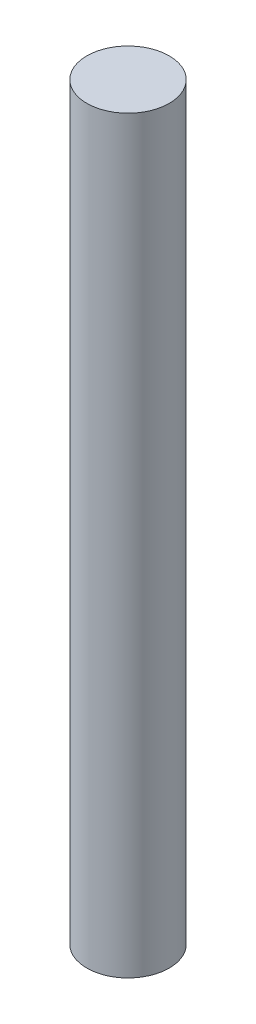
ISO-10303-21;
HEADER;
FILE_DESCRIPTION(('STEP AP214'),'2;1');
FILE_NAME('part.step','',(''),(''),'','','');
FILE_SCHEMA(('AUTOMOTIVE_DESIGN { 1 0 10303 214 1 1 1 1 }'));
ENDSEC;
DATA;
#1=APPLICATION_CONTEXT('core data for automotive mechanical design processes');
#2=APPLICATION_PROTOCOL_DEFINITION('international standard','automotive_design',2000,#1);
#3=PRODUCT_CONTEXT('',#1,'mechanical');
#4=PRODUCT('Part','Part','',(#3));
#5=PRODUCT_RELATED_PRODUCT_CATEGORY('part','',(#4));
#6=PRODUCT_DEFINITION_FORMATION('','',#4);
#7=PRODUCT_DEFINITION_CONTEXT('part definition',#1,'design');
#8=PRODUCT_DEFINITION('design','',#6,#7);
#9=PRODUCT_DEFINITION_SHAPE('','',#8);
#10=(LENGTH_UNIT() NAMED_UNIT(*) SI_UNIT(.MILLI.,.METRE.));
#11=(NAMED_UNIT(*) PLANE_ANGLE_UNIT() SI_UNIT($,.RADIAN.));
#12=(NAMED_UNIT(*) SI_UNIT($,.STERADIAN.) SOLID_ANGLE_UNIT());
#13=UNCERTAINTY_MEASURE_WITH_UNIT(LENGTH_MEASURE(1.E-05),#10,'distance_accuracy_value','');
#14=(GEOMETRIC_REPRESENTATION_CONTEXT(3) GLOBAL_UNCERTAINTY_ASSIGNED_CONTEXT((#13)) GLOBAL_UNIT_ASSIGNED_CONTEXT((#10,
#11,#12)) REPRESENTATION_CONTEXT('',''));
#15=CARTESIAN_POINT('',(0.,0.,0.));
#16=DIRECTION('',(0.,0.,1.));
#17=DIRECTION('',(1.,0.,0.));
#18=AXIS2_PLACEMENT_3D('',#15,#16,#17);
#19=CARTESIAN_POINT('',(0.,0.,0.));
#20=DIRECTION('',(0.,1.,0.));
#21=DIRECTION('',(0.,0.,1.));
#22=AXIS2_PLACEMENT_3D('',#19,#20,#21);
#23=PLANE('',#22);
#24=CARTESIAN_POINT('',(0.,0.,0.));
#25=DIRECTION('',(0.,-1.,0.));
#26=DIRECTION('',(0.,0.,-1.));
#27=AXIS2_PLACEMENT_3D('',#24,#25,#26);
#28=CIRCLE('',#27,1.1);
#29=CARTESIAN_POINT('',(0.,0.,-1.1));
#30=VERTEX_POINT('',#29);
#31=EDGE_CURVE('E10',#30,#30,#28,.T.);
#32=ORIENTED_EDGE('',*,*,#31,.F.);
#33=EDGE_LOOP('',(#32));
#34=FACE_BOUND('',#33,.T.);
#35=ADVANCED_FACE('F31',(#34),#23,.T.);
#36=CARTESIAN_POINT('',(0.,-24.,0.));
#37=DIRECTION('',(0.,-1.,0.));
#38=DIRECTION('',(0.,0.,-1.));
#39=AXIS2_PLACEMENT_3D('',#36,#37,#38);
#40=CYLINDRICAL_SURFACE('',#39,1.1);
#41=ORIENTED_EDGE('',*,*,#31,.T.);
#42=EDGE_LOOP('',(#41));
#43=FACE_BOUND('',#42,.T.);
#44=CARTESIAN_POINT('',(0.,-20.,0.));
#45=DIRECTION('',(0.,-1.,0.));
#46=DIRECTION('',(0.,0.,-1.));
#47=AXIS2_PLACEMENT_3D('',#44,#45,#46);
#48=CIRCLE('',#47,1.1);
#49=CARTESIAN_POINT('',(0.,-20.,-1.1));
#50=VERTEX_POINT('',#49);
#51=EDGE_CURVE('E37',#50,#50,#48,.T.);
#52=ORIENTED_EDGE('',*,*,#51,.F.);
#53=EDGE_LOOP('',(#52));
#54=FACE_BOUND('',#53,.T.);
#55=ADVANCED_FACE('F45',(#43,#54),#40,.T.);
#56=CARTESIAN_POINT('',(1.1,-20.,0.));
#57=DIRECTION('',(0.,-1.,0.));
#58=DIRECTION('',(0.,0.,-1.));
#59=AXIS2_PLACEMENT_3D('',#56,#57,#58);
#60=PLANE('',#59);
#61=ORIENTED_EDGE('',*,*,#51,.T.);
#62=EDGE_LOOP('',(#61));
#63=FACE_BOUND('',#62,.T.);
#64=ADVANCED_FACE('F43',(#63),#60,.T.);
#65=CLOSED_SHELL('',(#35,#55,#64));
#66=MANIFOLD_SOLID_BREP('B2',#65);
#67=ADVANCED_BREP_SHAPE_REPRESENTATION('',(#18,#66),#14);
#68=SHAPE_DEFINITION_REPRESENTATION(#9,#67);
ENDSEC;
END-ISO-10303-21;
